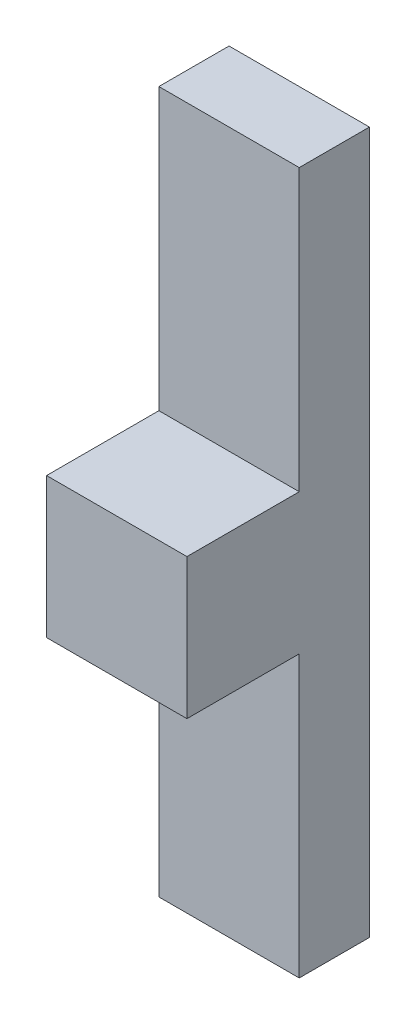
ISO-10303-21;
HEADER;
FILE_DESCRIPTION(('STEP AP214'),'2;1');
FILE_NAME('part.step','',(''),(''),'','','');
FILE_SCHEMA(('AUTOMOTIVE_DESIGN { 1 0 10303 214 1 1 1 1 }'));
ENDSEC;
DATA;
#1=APPLICATION_CONTEXT('core data for automotive mechanical design processes');
#2=APPLICATION_PROTOCOL_DEFINITION('international standard','automotive_design',2000,#1);
#3=PRODUCT_CONTEXT('',#1,'mechanical');
#4=PRODUCT('Part','Part','',(#3));
#5=PRODUCT_RELATED_PRODUCT_CATEGORY('part','',(#4));
#6=PRODUCT_DEFINITION_FORMATION('','',#4);
#7=PRODUCT_DEFINITION_CONTEXT('part definition',#1,'design');
#8=PRODUCT_DEFINITION('design','',#6,#7);
#9=PRODUCT_DEFINITION_SHAPE('','',#8);
#10=(LENGTH_UNIT() NAMED_UNIT(*) SI_UNIT(.MILLI.,.METRE.));
#11=(NAMED_UNIT(*) PLANE_ANGLE_UNIT() SI_UNIT($,.RADIAN.));
#12=(NAMED_UNIT(*) SI_UNIT($,.STERADIAN.) SOLID_ANGLE_UNIT());
#13=UNCERTAINTY_MEASURE_WITH_UNIT(LENGTH_MEASURE(1.E-05),#10,'distance_accuracy_value','');
#14=(GEOMETRIC_REPRESENTATION_CONTEXT(3) GLOBAL_UNCERTAINTY_ASSIGNED_CONTEXT((#13)) GLOBAL_UNIT_ASSIGNED_CONTEXT((#10,
#11,#12)) REPRESENTATION_CONTEXT('',''));
#15=CARTESIAN_POINT('',(0.,0.,0.));
#16=DIRECTION('',(0.,0.,1.));
#17=DIRECTION('',(1.,0.,0.));
#18=AXIS2_PLACEMENT_3D('',#15,#16,#17);
#19=CARTESIAN_POINT('',(0.,0.,6.35));
#20=DIRECTION('',(0.,0.,1.));
#21=DIRECTION('',(1.,0.,0.));
#22=AXIS2_PLACEMENT_3D('',#19,#20,#21);
#23=PLANE('',#22);
#24=DIRECTION('',(-1.,0.,0.));
#25=VECTOR('',#24,1.);
#26=CARTESIAN_POINT('',(-2.91915446042015,6.35,6.35));
#27=LINE('',#26,#25);
#28=CARTESIAN_POINT('',(-2.91915446042015,6.35,6.35));
#29=VERTEX_POINT('',#28);
#30=CARTESIAN_POINT('',(-15.6191544604201,6.35,6.35));
#31=VERTEX_POINT('',#30);
#32=EDGE_CURVE('E123',#29,#31,#27,.T.);
#33=ORIENTED_EDGE('',*,*,#32,.F.);
#34=DIRECTION('',(0.,1.,0.));
#35=VECTOR('',#34,1.);
#36=CARTESIAN_POINT('',(-2.91915446042015,31.75,6.35));
#37=LINE('',#36,#35);
#38=CARTESIAN_POINT('',(-2.91915446042015,31.75,6.35));
#39=VERTEX_POINT('',#38);
#40=EDGE_CURVE('E140',#29,#39,#37,.T.);
#41=ORIENTED_EDGE('',*,*,#40,.T.);
#42=DIRECTION('',(-1.,0.,0.));
#43=VECTOR('',#42,1.);
#44=CARTESIAN_POINT('',(-15.6191544604201,31.75,6.35));
#45=LINE('',#44,#43);
#46=CARTESIAN_POINT('',(-15.6191544604201,31.75,6.35));
#47=VERTEX_POINT('',#46);
#48=EDGE_CURVE('E139',#39,#47,#45,.T.);
#49=ORIENTED_EDGE('',*,*,#48,.T.);
#50=DIRECTION('',(0.,-1.,0.));
#51=VECTOR('',#50,1.);
#52=CARTESIAN_POINT('',(-15.6191544604201,31.75,6.35));
#53=LINE('',#52,#51);
#54=EDGE_CURVE('E62',#47,#31,#53,.T.);
#55=ORIENTED_EDGE('',*,*,#54,.T.);
#56=EDGE_LOOP('',(#33,#41,#49,#55));
#57=FACE_BOUND('',#56,.T.);
#58=ADVANCED_FACE('F39',(#57),#23,.T.);
#59=CARTESIAN_POINT('',(-2.91915446042015,31.75,6.35));
#60=DIRECTION('',(-1.,0.,0.));
#61=DIRECTION('',(0.,0.,1.));
#62=AXIS2_PLACEMENT_3D('',#59,#60,#61);
#63=PLANE('',#62);
#64=DIRECTION('',(0.,1.,0.));
#65=VECTOR('',#64,1.);
#66=CARTESIAN_POINT('',(-2.91915446042015,31.75,0.));
#67=LINE('',#66,#65);
#68=CARTESIAN_POINT('',(-2.91915446042015,-31.75,0.));
#69=VERTEX_POINT('',#68);
#70=CARTESIAN_POINT('',(-2.91915446042015,31.75,0.));
#71=VERTEX_POINT('',#70);
#72=EDGE_CURVE('E128',#69,#71,#67,.T.);
#73=ORIENTED_EDGE('',*,*,#72,.T.);
#74=DIRECTION('',(0.,0.,-1.));
#75=VECTOR('',#74,1.);
#76=CARTESIAN_POINT('',(-2.91915446042015,31.75,6.35));
#77=LINE('',#76,#75);
#78=EDGE_CURVE('E11',#39,#71,#77,.T.);
#79=ORIENTED_EDGE('',*,*,#78,.F.);
#80=ORIENTED_EDGE('',*,*,#40,.F.);
#81=DIRECTION('',(0.,0.,-1.));
#82=VECTOR('',#81,1.);
#83=CARTESIAN_POINT('',(-2.91915446042015,6.35,16.51));
#84=LINE('',#83,#82);
#85=CARTESIAN_POINT('',(-2.91915446042015,6.35,16.51));
#86=VERTEX_POINT('',#85);
#87=EDGE_CURVE('E133',#86,#29,#84,.T.);
#88=ORIENTED_EDGE('',*,*,#87,.F.);
#89=DIRECTION('',(0.,1.,0.));
#90=VECTOR('',#89,1.);
#91=CARTESIAN_POINT('',(-2.91915446042015,-6.35,16.51));
#92=LINE('',#91,#90);
#93=CARTESIAN_POINT('',(-2.91915446042015,-6.35,16.51));
#94=VERTEX_POINT('',#93);
#95=EDGE_CURVE('E113',#94,#86,#92,.T.);
#96=ORIENTED_EDGE('',*,*,#95,.F.);
#97=DIRECTION('',(0.,0.,-1.));
#98=VECTOR('',#97,1.);
#99=CARTESIAN_POINT('',(-2.91915446042015,-6.35,16.51));
#100=LINE('',#99,#98);
#101=CARTESIAN_POINT('',(-2.91915446042015,-6.35,6.35));
#102=VERTEX_POINT('',#101);
#103=EDGE_CURVE('E110',#94,#102,#100,.T.);
#104=ORIENTED_EDGE('',*,*,#103,.T.);
#105=CARTESIAN_POINT('',(-2.91915446042015,-31.75,6.35));
#106=VERTEX_POINT('',#105);
#107=EDGE_CURVE('E137',#106,#102,#37,.T.);
#108=ORIENTED_EDGE('',*,*,#107,.F.);
#109=DIRECTION('',(0.,0.,-1.));
#110=VECTOR('',#109,1.);
#111=CARTESIAN_POINT('',(-2.91915446042015,-31.75,6.35));
#112=LINE('',#111,#110);
#113=EDGE_CURVE('E144',#106,#69,#112,.T.);
#114=ORIENTED_EDGE('',*,*,#113,.T.);
#115=EDGE_LOOP('',(#73,#79,#80,#88,#96,#104,#108,#114));
#116=FACE_BOUND('',#115,.T.);
#117=ADVANCED_FACE('F41',(#116),#63,.F.);
#118=CARTESIAN_POINT('',(-15.6191544604201,31.75,6.35));
#119=DIRECTION('',(0.,-1.,0.));
#120=DIRECTION('',(0.,0.,-1.));
#121=AXIS2_PLACEMENT_3D('',#118,#119,#120);
#122=PLANE('',#121);
#123=DIRECTION('',(-1.,0.,0.));
#124=VECTOR('',#123,1.);
#125=CARTESIAN_POINT('',(-15.6191544604201,31.75,0.));
#126=LINE('',#125,#124);
#127=CARTESIAN_POINT('',(-15.6191544604201,31.75,0.));
#128=VERTEX_POINT('',#127);
#129=EDGE_CURVE('E131',#71,#128,#126,.T.);
#130=ORIENTED_EDGE('',*,*,#129,.T.);
#131=DIRECTION('',(0.,0.,-1.));
#132=VECTOR('',#131,1.);
#133=CARTESIAN_POINT('',(-15.6191544604201,31.75,6.35));
#134=LINE('',#133,#132);
#135=EDGE_CURVE('E47',#47,#128,#134,.T.);
#136=ORIENTED_EDGE('',*,*,#135,.F.);
#137=ORIENTED_EDGE('',*,*,#48,.F.);
#138=ORIENTED_EDGE('',*,*,#78,.T.);
#139=EDGE_LOOP('',(#130,#136,#137,#138));
#140=FACE_BOUND('',#139,.T.);
#141=ADVANCED_FACE('F183',(#140),#122,.F.);
#142=CARTESIAN_POINT('',(-15.6191544604201,31.75,6.35));
#143=DIRECTION('',(1.,0.,0.));
#144=DIRECTION('',(0.,0.,-1.));
#145=AXIS2_PLACEMENT_3D('',#142,#143,#144);
#146=PLANE('',#145);
#147=DIRECTION('',(0.,-1.,0.));
#148=VECTOR('',#147,1.);
#149=CARTESIAN_POINT('',(-15.6191544604201,31.75,0.));
#150=LINE('',#149,#148);
#151=CARTESIAN_POINT('',(-15.6191544604201,-31.75,0.));
#152=VERTEX_POINT('',#151);
#153=EDGE_CURVE('E147',#128,#152,#150,.T.);
#154=ORIENTED_EDGE('',*,*,#153,.T.);
#155=DIRECTION('',(0.,0.,-1.));
#156=VECTOR('',#155,1.);
#157=CARTESIAN_POINT('',(-15.6191544604201,-31.75,6.35));
#158=LINE('',#157,#156);
#159=CARTESIAN_POINT('',(-15.6191544604201,-31.75,6.35));
#160=VERTEX_POINT('',#159);
#161=EDGE_CURVE('E153',#160,#152,#158,.T.);
#162=ORIENTED_EDGE('',*,*,#161,.F.);
#163=CARTESIAN_POINT('',(-15.6191544604201,-6.35,6.35));
#164=VERTEX_POINT('',#163);
#165=EDGE_CURVE('E127',#164,#160,#53,.T.);
#166=ORIENTED_EDGE('',*,*,#165,.F.);
#167=DIRECTION('',(0.,0.,-1.));
#168=VECTOR('',#167,1.);
#169=CARTESIAN_POINT('',(-15.6191544604201,-6.35,16.51));
#170=LINE('',#169,#168);
#171=CARTESIAN_POINT('',(-15.6191544604201,-6.35,16.51));
#172=VERTEX_POINT('',#171);
#173=EDGE_CURVE('E108',#172,#164,#170,.T.);
#174=ORIENTED_EDGE('',*,*,#173,.F.);
#175=DIRECTION('',(0.,-1.,0.));
#176=VECTOR('',#175,1.);
#177=CARTESIAN_POINT('',(-15.6191544604201,-6.35,16.51));
#178=LINE('',#177,#176);
#179=CARTESIAN_POINT('',(-15.6191544604201,6.35,16.51));
#180=VERTEX_POINT('',#179);
#181=EDGE_CURVE('E114',#180,#172,#178,.T.);
#182=ORIENTED_EDGE('',*,*,#181,.F.);
#183=DIRECTION('',(0.,0.,-1.));
#184=VECTOR('',#183,1.);
#185=CARTESIAN_POINT('',(-15.6191544604201,6.35,16.51));
#186=LINE('',#185,#184);
#187=EDGE_CURVE('E177',#180,#31,#186,.T.);
#188=ORIENTED_EDGE('',*,*,#187,.T.);
#189=ORIENTED_EDGE('',*,*,#54,.F.);
#190=ORIENTED_EDGE('',*,*,#135,.T.);
#191=EDGE_LOOP('',(#154,#162,#166,#174,#182,#188,#189,#190));
#192=FACE_BOUND('',#191,.T.);
#193=ADVANCED_FACE('F125',(#192),#146,.F.);
#194=CARTESIAN_POINT('',(-15.6191544604201,-31.75,6.35));
#195=DIRECTION('',(0.,1.,0.));
#196=DIRECTION('',(0.,0.,1.));
#197=AXIS2_PLACEMENT_3D('',#194,#195,#196);
#198=PLANE('',#197);
#199=DIRECTION('',(1.,0.,0.));
#200=VECTOR('',#199,1.);
#201=CARTESIAN_POINT('',(-15.6191544604201,-31.75,0.));
#202=LINE('',#201,#200);
#203=EDGE_CURVE('E149',#152,#69,#202,.T.);
#204=ORIENTED_EDGE('',*,*,#203,.T.);
#205=ORIENTED_EDGE('',*,*,#113,.F.);
#206=DIRECTION('',(1.,0.,0.));
#207=VECTOR('',#206,1.);
#208=CARTESIAN_POINT('',(-15.6191544604201,-31.75,6.35));
#209=LINE('',#208,#207);
#210=EDGE_CURVE('E143',#160,#106,#209,.T.);
#211=ORIENTED_EDGE('',*,*,#210,.F.);
#212=ORIENTED_EDGE('',*,*,#161,.T.);
#213=EDGE_LOOP('',(#204,#205,#211,#212));
#214=FACE_BOUND('',#213,.T.);
#215=ADVANCED_FACE('F166',(#214),#198,.F.);
#216=DIRECTION('',(1.,0.,0.));
#217=VECTOR('',#216,1.);
#218=CARTESIAN_POINT('',(-2.91915446042015,-6.35,6.35));
#219=LINE('',#218,#217);
#220=EDGE_CURVE('E54',#164,#102,#219,.T.);
#221=ORIENTED_EDGE('',*,*,#220,.F.);
#222=ORIENTED_EDGE('',*,*,#165,.T.);
#223=ORIENTED_EDGE('',*,*,#210,.T.);
#224=ORIENTED_EDGE('',*,*,#107,.T.);
#225=EDGE_LOOP('',(#221,#222,#223,#224));
#226=FACE_BOUND('',#225,.T.);
#227=ADVANCED_FACE('F171',(#226),#23,.T.);
#228=CARTESIAN_POINT('',(0.,0.,0.));
#229=DIRECTION('',(0.,0.,1.));
#230=DIRECTION('',(1.,0.,0.));
#231=AXIS2_PLACEMENT_3D('',#228,#229,#230);
#232=PLANE('',#231);
#233=ORIENTED_EDGE('',*,*,#72,.F.);
#234=ORIENTED_EDGE('',*,*,#203,.F.);
#235=ORIENTED_EDGE('',*,*,#153,.F.);
#236=ORIENTED_EDGE('',*,*,#129,.F.);
#237=EDGE_LOOP('',(#233,#234,#235,#236));
#238=FACE_BOUND('',#237,.T.);
#239=ADVANCED_FACE('F163',(#238),#232,.F.);
#240=CARTESIAN_POINT('',(-2.91915446042015,-6.35,16.51));
#241=DIRECTION('',(0.,1.,0.));
#242=DIRECTION('',(-1.,0.,0.));
#243=AXIS2_PLACEMENT_3D('',#240,#241,#242);
#244=PLANE('',#243);
#245=ORIENTED_EDGE('',*,*,#220,.T.);
#246=ORIENTED_EDGE('',*,*,#103,.F.);
#247=DIRECTION('',(1.,0.,0.));
#248=VECTOR('',#247,1.);
#249=CARTESIAN_POINT('',(-2.91915446042015,-6.35,16.51));
#250=LINE('',#249,#248);
#251=EDGE_CURVE('E104',#172,#94,#250,.T.);
#252=ORIENTED_EDGE('',*,*,#251,.F.);
#253=ORIENTED_EDGE('',*,*,#173,.T.);
#254=EDGE_LOOP('',(#245,#246,#252,#253));
#255=FACE_BOUND('',#254,.T.);
#256=ADVANCED_FACE('F106',(#255),#244,.F.);
#257=CARTESIAN_POINT('',(-2.91915446042015,6.35,16.51));
#258=DIRECTION('',(0.,-1.,0.));
#259=DIRECTION('',(1.,0.,0.));
#260=AXIS2_PLACEMENT_3D('',#257,#258,#259);
#261=PLANE('',#260);
#262=ORIENTED_EDGE('',*,*,#32,.T.);
#263=ORIENTED_EDGE('',*,*,#187,.F.);
#264=DIRECTION('',(-1.,0.,0.));
#265=VECTOR('',#264,1.);
#266=CARTESIAN_POINT('',(-2.91915446042015,6.35,16.51));
#267=LINE('',#266,#265);
#268=EDGE_CURVE('E119',#86,#180,#267,.T.);
#269=ORIENTED_EDGE('',*,*,#268,.F.);
#270=ORIENTED_EDGE('',*,*,#87,.T.);
#271=EDGE_LOOP('',(#262,#263,#269,#270));
#272=FACE_BOUND('',#271,.T.);
#273=ADVANCED_FACE('F181',(#272),#261,.F.);
#274=CARTESIAN_POINT('',(0.,0.,16.51));
#275=DIRECTION('',(0.,0.,1.));
#276=DIRECTION('',(1.,0.,0.));
#277=AXIS2_PLACEMENT_3D('',#274,#275,#276);
#278=PLANE('',#277);
#279=ORIENTED_EDGE('',*,*,#181,.T.);
#280=ORIENTED_EDGE('',*,*,#251,.T.);
#281=ORIENTED_EDGE('',*,*,#95,.T.);
#282=ORIENTED_EDGE('',*,*,#268,.T.);
#283=EDGE_LOOP('',(#279,#280,#281,#282));
#284=FACE_BOUND('',#283,.T.);
#285=ADVANCED_FACE('F117',(#284),#278,.T.);
#286=CLOSED_SHELL('',(#58,#117,#141,#193,#215,#227,#239,#256,#273,#285));
#287=MANIFOLD_SOLID_BREP('B2',#286);
#288=ADVANCED_BREP_SHAPE_REPRESENTATION('',(#18,#287),#14);
#289=SHAPE_DEFINITION_REPRESENTATION(#9,#288);
ENDSEC;
END-ISO-10303-21;
